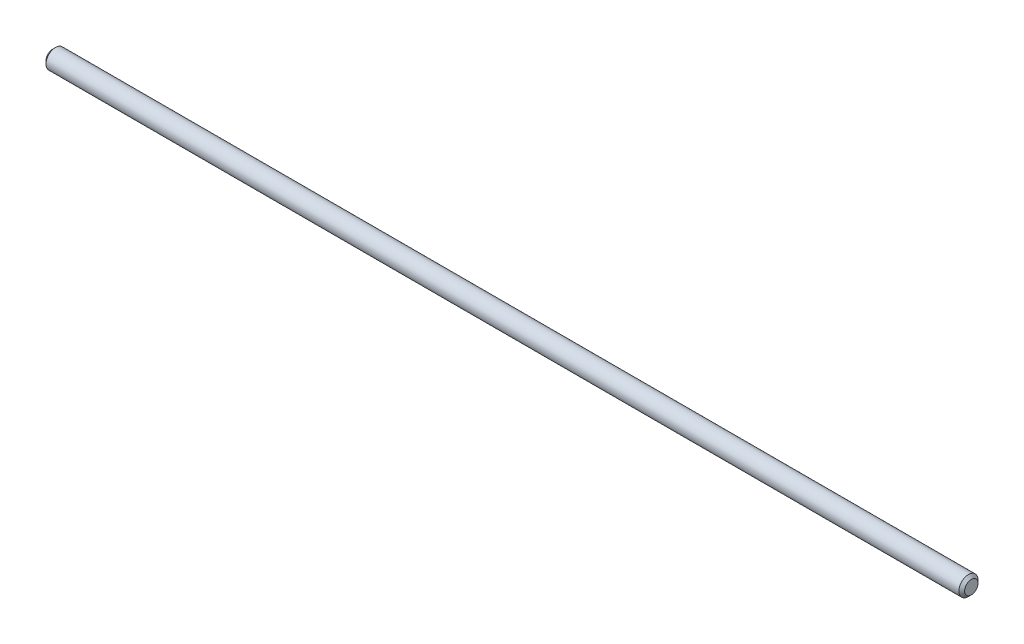
ISO-10303-21;
HEADER;
FILE_DESCRIPTION(('STEP AP214'),'2;1');
FILE_NAME('part.step','',(''),(''),'','','');
FILE_SCHEMA(('AUTOMOTIVE_DESIGN { 1 0 10303 214 1 1 1 1 }'));
ENDSEC;
DATA;
#1=APPLICATION_CONTEXT('core data for automotive mechanical design processes');
#2=APPLICATION_PROTOCOL_DEFINITION('international standard','automotive_design',2000,#1);
#3=PRODUCT_CONTEXT('',#1,'mechanical');
#4=PRODUCT('Part','Part','',(#3));
#5=PRODUCT_RELATED_PRODUCT_CATEGORY('part','',(#4));
#6=PRODUCT_DEFINITION_FORMATION('','',#4);
#7=PRODUCT_DEFINITION_CONTEXT('part definition',#1,'design');
#8=PRODUCT_DEFINITION('design','',#6,#7);
#9=PRODUCT_DEFINITION_SHAPE('','',#8);
#10=(LENGTH_UNIT() NAMED_UNIT(*) SI_UNIT(.MILLI.,.METRE.));
#11=(NAMED_UNIT(*) PLANE_ANGLE_UNIT() SI_UNIT($,.RADIAN.));
#12=(NAMED_UNIT(*) SI_UNIT($,.STERADIAN.) SOLID_ANGLE_UNIT());
#13=UNCERTAINTY_MEASURE_WITH_UNIT(LENGTH_MEASURE(1.E-05),#10,'distance_accuracy_value','');
#14=(GEOMETRIC_REPRESENTATION_CONTEXT(3) GLOBAL_UNCERTAINTY_ASSIGNED_CONTEXT((#13)) GLOBAL_UNIT_ASSIGNED_CONTEXT((#10,
#11,#12)) REPRESENTATION_CONTEXT('',''));
#15=CARTESIAN_POINT('',(0.,0.,0.));
#16=DIRECTION('',(0.,0.,1.));
#17=DIRECTION('',(1.,0.,0.));
#18=AXIS2_PLACEMENT_3D('',#15,#16,#17);
#19=CARTESIAN_POINT('',(-152.4,0.,0.));
#20=DIRECTION('',(1.,0.,0.));
#21=DIRECTION('',(0.,0.,-1.));
#22=AXIS2_PLACEMENT_3D('',#19,#20,#21);
#23=CYLINDRICAL_SURFACE('',#22,3.17499999999998);
#24=CARTESIAN_POINT('',(-151.4475,0.,0.));
#25=DIRECTION('',(1.,0.,0.));
#26=DIRECTION('',(0.,0.,-1.));
#27=AXIS2_PLACEMENT_3D('',#24,#25,#26);
#28=CIRCLE('',#27,3.17499999999998);
#29=CARTESIAN_POINT('',(-151.4475,0.,-3.17499999999998));
#30=VERTEX_POINT('',#29);
#31=EDGE_CURVE('E56',#30,#30,#28,.T.);
#32=CARTESIAN_POINT('',(151.4475,0.,0.));
#33=DIRECTION('',(1.,0.,0.));
#34=DIRECTION('',(0.,0.,-1.));
#35=AXIS2_PLACEMENT_3D('',#32,#33,#34);
#36=CIRCLE('',#35,3.17499999999998);
#37=CARTESIAN_POINT('',(151.4475,0.,-3.17499999999998));
#38=VERTEX_POINT('',#37);
#39=EDGE_CURVE('E61',#38,#38,#36,.F.);
#40=CARTESIAN_POINT('',(-151.4475,0.,-3.17499999999998));
#41=CARTESIAN_POINT('',(-148.29234375,0.,-3.17499999999998));
#42=CARTESIAN_POINT('',(-145.1371875,0.,-3.17499999999998));
#43=CARTESIAN_POINT('',(-138.826875,0.,-3.17499999999998));
#44=CARTESIAN_POINT('',(-135.67171875,0.,-3.17499999999998));
#45=CARTESIAN_POINT('',(-129.36140625,0.,-3.17499999999998));
#46=CARTESIAN_POINT('',(-126.20625,0.,-3.17499999999998));
#47=CARTESIAN_POINT('',(-119.8959375,0.,-3.17499999999998));
#48=CARTESIAN_POINT('',(-116.74078125,0.,-3.17499999999998));
#49=CARTESIAN_POINT('',(-110.43046875,0.,-3.17499999999998));
#50=CARTESIAN_POINT('',(-107.2753125,0.,-3.17499999999998));
#51=CARTESIAN_POINT('',(-100.965,0.,-3.17499999999998));
#52=CARTESIAN_POINT('',(-97.8098437499998,0.,-3.17499999999998));
#53=CARTESIAN_POINT('',(-91.4995312499998,0.,-3.17499999999998));
#54=CARTESIAN_POINT('',(-88.3443749999998,0.,-3.17499999999998));
#55=CARTESIAN_POINT('',(-82.0340624999998,0.,-3.17499999999998));
#56=CARTESIAN_POINT('',(-78.8789062499999,0.,-3.17499999999998));
#57=CARTESIAN_POINT('',(-72.5685937499998,0.,-3.17499999999998));
#58=CARTESIAN_POINT('',(-69.4134374999999,0.,-3.17499999999998));
#59=CARTESIAN_POINT('',(-63.1031249999999,0.,-3.17499999999998));
#60=CARTESIAN_POINT('',(-59.9479687499999,0.,-3.17499999999998));
#61=CARTESIAN_POINT('',(-53.6376562499999,0.,-3.17499999999998));
#62=CARTESIAN_POINT('',(-50.4824999999999,0.,-3.17499999999998));
#63=CARTESIAN_POINT('',(-44.1721874999999,0.,-3.17499999999998));
#64=CARTESIAN_POINT('',(-41.0170312499999,0.,-3.17499999999998));
#65=CARTESIAN_POINT('',(-34.7067187499999,0.,-3.17499999999998));
#66=CARTESIAN_POINT('',(-31.5515624999999,0.,-3.17499999999998));
#67=CARTESIAN_POINT('',(-25.2412499999999,0.,-3.17499999999998));
#68=CARTESIAN_POINT('',(-22.0860937499999,0.,-3.17499999999998));
#69=CARTESIAN_POINT('',(-15.7757812499999,0.,-3.17499999999998));
#70=CARTESIAN_POINT('',(-12.6206249999999,0.,-3.17499999999998));
#71=CARTESIAN_POINT('',(-6.31031249999988,0.,-3.17499999999998));
#72=CARTESIAN_POINT('',(-3.15515624999988,0.,-3.17499999999998));
#73=CARTESIAN_POINT('',(3.15515625000011,0.,-3.17499999999998));
#74=CARTESIAN_POINT('',(6.3103125000001,0.,-3.17499999999998));
#75=CARTESIAN_POINT('',(12.6206250000001,0.,-3.17499999999998));
#76=CARTESIAN_POINT('',(15.7757812500001,0.,-3.17499999999998));
#77=CARTESIAN_POINT('',(22.0860937500001,0.,-3.17499999999998));
#78=CARTESIAN_POINT('',(25.2412500000001,0.,-3.17499999999998));
#79=CARTESIAN_POINT('',(31.5515625000001,0.,-3.17499999999998));
#80=CARTESIAN_POINT('',(34.7067187500001,0.,-3.17499999999998));
#81=CARTESIAN_POINT('',(41.0170312500001,0.,-3.17499999999998));
#82=CARTESIAN_POINT('',(44.1721875000001,0.,-3.17499999999998));
#83=CARTESIAN_POINT('',(50.4825000000001,0.,-3.17499999999998));
#84=CARTESIAN_POINT('',(53.6376562500001,0.,-3.17499999999998));
#85=CARTESIAN_POINT('',(59.9479687500001,0.,-3.17499999999998));
#86=CARTESIAN_POINT('',(63.103125,0.,-3.17499999999998));
#87=CARTESIAN_POINT('',(69.4134375,0.,-3.17499999999998));
#88=CARTESIAN_POINT('',(72.56859375,0.,-3.17499999999998));
#89=CARTESIAN_POINT('',(78.87890625,0.,-3.17499999999998));
#90=CARTESIAN_POINT('',(82.0340625000001,0.,-3.17499999999998));
#91=CARTESIAN_POINT('',(88.3443750000001,0.,-3.17499999999998));
#92=CARTESIAN_POINT('',(91.4995312500001,0.,-3.17499999999998));
#93=CARTESIAN_POINT('',(97.80984375,0.,-3.17499999999998));
#94=CARTESIAN_POINT('',(100.965,0.,-3.17499999999998));
#95=CARTESIAN_POINT('',(107.2753125,0.,-3.17499999999998));
#96=CARTESIAN_POINT('',(110.43046875,0.,-3.17499999999998));
#97=CARTESIAN_POINT('',(116.74078125,0.,-3.17499999999998));
#98=CARTESIAN_POINT('',(119.8959375,0.,-3.17499999999998));
#99=CARTESIAN_POINT('',(126.20625,0.,-3.17499999999998));
#100=CARTESIAN_POINT('',(129.36140625,0.,-3.17499999999998));
#101=CARTESIAN_POINT('',(135.67171875,0.,-3.17499999999998));
#102=CARTESIAN_POINT('',(138.826875,0.,-3.17499999999998));
#103=CARTESIAN_POINT('',(145.1371875,0.,-3.17499999999998));
#104=CARTESIAN_POINT('',(148.29234375,0.,-3.17499999999998));
#105=CARTESIAN_POINT('',(151.4475,0.,-3.17499999999998));
#106=B_SPLINE_CURVE_WITH_KNOTS('',3,(#40,#41,#42,#43,#44,#45,#46,#47,#48,#49,#50,#51,#52,#53,
#54,#55,#56,#57,#58,#59,#60,#61,#62,#63,#64,#65,#66,#67,#68,#69,#70,#71,#72,#73,#74,#75,#76,#77,
#78,#79,#80,#81,#82,#83,#84,#85,#86,#87,#88,#89,#90,#91,#92,#93,#94,#95,#96,#97,#98,#99,#100,
#101,#102,#103,#104,#105),.UNSPECIFIED.,.F.,.F.,(4,2,2,2,2,2,2,2,2,2,2,2,2,2,2,2,2,2,2,2,2,2,2,
2,2,2,2,2,2,2,2,2,4),(0.,9.46546875000001,18.9309375,28.39640625,37.861875,47.32734375,
56.7928125,66.25828125,75.72375,85.18921875,94.6546875,104.12015625,113.585625,123.05109375,
132.5165625,141.98203125,151.4475,160.91296875,170.3784375,179.84390625,189.309375,198.77484375,
208.2403125,217.70578125,227.17125,236.63671875,246.1021875,255.56765625,265.033125,
274.49859375,283.9640625,293.42953125,302.895),.UNSPECIFIED.);
#107=EDGE_CURVE('BSEAM43',#30,#38,#106,.T.);
#108=ORIENTED_EDGE('',*,*,#31,.T.);
#109=ORIENTED_EDGE('',*,*,#39,.T.);
#110=ORIENTED_EDGE('',*,*,#107,.T.);
#111=ORIENTED_EDGE('',*,*,#107,.F.);
#112=EDGE_LOOP('',(#108,#110,#109,#111));
#113=FACE_BOUND('',#112,.T.);
#114=ADVANCED_FACE('F43',(#113),#23,.T.);
#115=CARTESIAN_POINT('',(-152.4,0.,0.));
#116=DIRECTION('',(1.,0.,0.));
#117=DIRECTION('',(0.,0.,-1.));
#118=AXIS2_PLACEMENT_3D('',#115,#116,#117);
#119=PLANE('',#118);
#120=CARTESIAN_POINT('',(-152.4,0.,0.));
#121=DIRECTION('',(1.,0.,0.));
#122=DIRECTION('',(0.,0.,-1.));
#123=AXIS2_PLACEMENT_3D('',#120,#121,#122);
#124=CIRCLE('',#123,2.22249999999974);
#125=CARTESIAN_POINT('',(-152.4,0.,-2.22249999999974));
#126=VERTEX_POINT('',#125);
#127=EDGE_CURVE('E51',#126,#126,#124,.F.);
#128=ORIENTED_EDGE('',*,*,#127,.T.);
#129=EDGE_LOOP('',(#128));
#130=FACE_BOUND('',#129,.T.);
#131=ADVANCED_FACE('F78',(#130),#119,.F.);
#132=CARTESIAN_POINT('',(152.4,0.,0.));
#133=DIRECTION('',(1.,0.,0.));
#134=DIRECTION('',(0.,0.,-1.));
#135=AXIS2_PLACEMENT_3D('',#132,#133,#134);
#136=PLANE('',#135);
#137=CARTESIAN_POINT('',(152.4,0.,0.));
#138=DIRECTION('',(1.,0.,0.));
#139=DIRECTION('',(0.,0.,-1.));
#140=AXIS2_PLACEMENT_3D('',#137,#138,#139);
#141=CIRCLE('',#140,2.22249999999996);
#142=CARTESIAN_POINT('',(152.4,0.,-2.22249999999996));
#143=VERTEX_POINT('',#142);
#144=EDGE_CURVE('E10',#143,#143,#141,.T.);
#145=ORIENTED_EDGE('',*,*,#144,.T.);
#146=EDGE_LOOP('',(#145));
#147=FACE_BOUND('',#146,.T.);
#148=ADVANCED_FACE('F75',(#147),#136,.T.);
#149=CARTESIAN_POINT('',(-151.4475,0.,0.));
#150=DIRECTION('',(1.,0.,0.));
#151=DIRECTION('',(0.,0.,-1.));
#152=AXIS2_PLACEMENT_3D('',#149,#150,#151);
#153=CONICAL_SURFACE('',#152,3.17499999999998,0.785398163397462);
#154=ORIENTED_EDGE('',*,*,#127,.F.);
#155=EDGE_LOOP('',(#154));
#156=FACE_BOUND('',#155,.T.);
#157=ORIENTED_EDGE('',*,*,#31,.F.);
#158=EDGE_LOOP('',(#157));
#159=FACE_BOUND('',#158,.T.);
#160=ADVANCED_FACE('F71',(#156,#159),#153,.T.);
#161=CARTESIAN_POINT('',(152.4,0.,0.));
#162=DIRECTION('',(-1.,0.,0.));
#163=DIRECTION('',(0.,0.,1.));
#164=AXIS2_PLACEMENT_3D('',#161,#162,#163);
#165=CONICAL_SURFACE('',#164,2.22249999999996,0.785398163397477);
#166=ORIENTED_EDGE('',*,*,#39,.F.);
#167=EDGE_LOOP('',(#166));
#168=FACE_BOUND('',#167,.T.);
#169=ORIENTED_EDGE('',*,*,#144,.F.);
#170=EDGE_LOOP('',(#169));
#171=FACE_BOUND('',#170,.T.);
#172=ADVANCED_FACE('F45',(#168,#171),#165,.T.);
#173=CLOSED_SHELL('',(#114,#131,#148,#160,#172));
#174=MANIFOLD_SOLID_BREP('B2',#173);
#175=ADVANCED_BREP_SHAPE_REPRESENTATION('',(#18,#174),#14);
#176=SHAPE_DEFINITION_REPRESENTATION(#9,#175);
ENDSEC;
END-ISO-10303-21;
